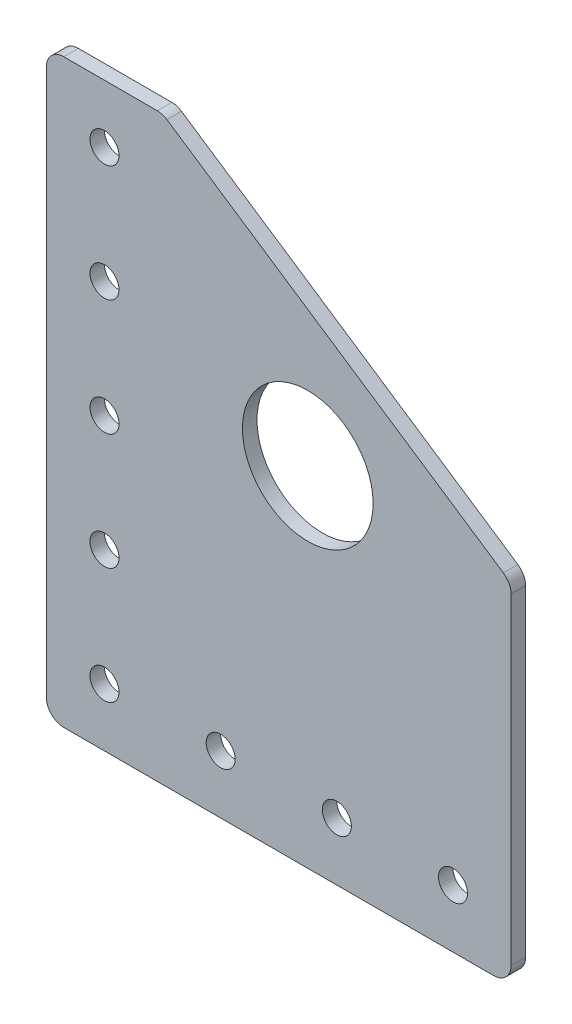
ISO-10303-21;
HEADER;
FILE_DESCRIPTION(('STEP AP214'),'2;1');
FILE_NAME('part.step','',(''),(''),'','','');
FILE_SCHEMA(('AUTOMOTIVE_DESIGN { 1 0 10303 214 1 1 1 1 }'));
ENDSEC;
DATA;
#1=APPLICATION_CONTEXT('core data for automotive mechanical design processes');
#2=APPLICATION_PROTOCOL_DEFINITION('international standard','automotive_design',2000,#1);
#3=PRODUCT_CONTEXT('',#1,'mechanical');
#4=PRODUCT('Part','Part','',(#3));
#5=PRODUCT_RELATED_PRODUCT_CATEGORY('part','',(#4));
#6=PRODUCT_DEFINITION_FORMATION('','',#4);
#7=PRODUCT_DEFINITION_CONTEXT('part definition',#1,'design');
#8=PRODUCT_DEFINITION('design','',#6,#7);
#9=PRODUCT_DEFINITION_SHAPE('','',#8);
#10=(LENGTH_UNIT() NAMED_UNIT(*) SI_UNIT(.MILLI.,.METRE.));
#11=(NAMED_UNIT(*) PLANE_ANGLE_UNIT() SI_UNIT($,.RADIAN.));
#12=(NAMED_UNIT(*) SI_UNIT($,.STERADIAN.) SOLID_ANGLE_UNIT());
#13=UNCERTAINTY_MEASURE_WITH_UNIT(LENGTH_MEASURE(1.E-05),#10,'distance_accuracy_value','');
#14=(GEOMETRIC_REPRESENTATION_CONTEXT(3) GLOBAL_UNCERTAINTY_ASSIGNED_CONTEXT((#13)) GLOBAL_UNIT_ASSIGNED_CONTEXT((#10,
#11,#12)) REPRESENTATION_CONTEXT('',''));
#15=CARTESIAN_POINT('',(0.,0.,0.));
#16=DIRECTION('',(0.,0.,1.));
#17=DIRECTION('',(1.,0.,0.));
#18=AXIS2_PLACEMENT_3D('',#15,#16,#17);
#19=CARTESIAN_POINT('',(0.,0.,3.175));
#20=DIRECTION('',(0.,0.,-1.));
#21=DIRECTION('',(-1.,0.,0.));
#22=AXIS2_PLACEMENT_3D('',#19,#20,#21);
#23=PLANE('',#22);
#24=DIRECTION('',(0.,-1.,0.));
#25=VECTOR('',#24,1.);
#26=CARTESIAN_POINT('',(0.,0.,3.175));
#27=LINE('',#26,#25);
#28=CARTESIAN_POINT('',(0.,123.19,3.175));
#29=VERTEX_POINT('',#28);
#30=CARTESIAN_POINT('',(0.,3.81,3.175));
#31=VERTEX_POINT('',#30);
#32=EDGE_CURVE('E160',#29,#31,#27,.T.);
#33=ORIENTED_EDGE('',*,*,#32,.T.);
#34=CARTESIAN_POINT('',(3.80999999999999,3.81,3.175));
#35=DIRECTION('',(0.,0.,-1.));
#36=DIRECTION('',(-1.,0.,0.));
#37=AXIS2_PLACEMENT_3D('',#34,#35,#36);
#38=CIRCLE('',#37,3.81);
#39=CARTESIAN_POINT('',(3.80999999999999,0.,3.175));
#40=VERTEX_POINT('',#39);
#41=EDGE_CURVE('E200',#31,#40,#38,.F.);
#42=ORIENTED_EDGE('',*,*,#41,.T.);
#43=DIRECTION('',(1.,0.,0.));
#44=VECTOR('',#43,1.);
#45=CARTESIAN_POINT('',(101.6,0.,3.175));
#46=LINE('',#45,#44);
#47=CARTESIAN_POINT('',(97.79,0.,3.175));
#48=VERTEX_POINT('',#47);
#49=EDGE_CURVE('E139',#40,#48,#46,.T.);
#50=ORIENTED_EDGE('',*,*,#49,.T.);
#51=CARTESIAN_POINT('',(97.79,3.80999999999999,3.175));
#52=DIRECTION('',(0.,0.,-1.));
#53=DIRECTION('',(-1.,0.,0.));
#54=AXIS2_PLACEMENT_3D('',#51,#52,#53);
#55=CIRCLE('',#54,3.81);
#56=CARTESIAN_POINT('',(101.6,3.81000000000002,3.175));
#57=VERTEX_POINT('',#56);
#58=EDGE_CURVE('E197',#48,#57,#55,.F.);
#59=ORIENTED_EDGE('',*,*,#58,.T.);
#60=DIRECTION('',(0.,1.,0.));
#61=VECTOR('',#60,1.);
#62=CARTESIAN_POINT('',(101.6,76.2,3.175));
#63=LINE('',#62,#61);
#64=CARTESIAN_POINT('',(101.6,74.1609498801607,3.175));
#65=VERTEX_POINT('',#64);
#66=EDGE_CURVE('E224',#57,#65,#63,.T.);
#67=ORIENTED_EDGE('',*,*,#66,.T.);
#68=CARTESIAN_POINT('',(97.79,74.1609498801607,3.175));
#69=DIRECTION('',(0.,0.,-1.));
#70=DIRECTION('',(-1.,0.,0.));
#71=AXIS2_PLACEMENT_3D('',#68,#69,#70);
#72=CIRCLE('',#71,3.81);
#73=CARTESIAN_POINT('',(99.9034077476181,77.3310615015879,3.175));
#74=VERTEX_POINT('',#73);
#75=EDGE_CURVE('E194',#65,#74,#72,.F.);
#76=ORIENTED_EDGE('',*,*,#75,.T.);
#77=DIRECTION('',(-0.832050294337844,0.554700196225229,0.));
#78=VECTOR('',#77,1.);
#79=CARTESIAN_POINT('',(25.4,127.,3.175));
#80=LINE('',#79,#78);
#81=CARTESIAN_POINT('',(26.3598325678592,126.360111621427,3.175));
#82=VERTEX_POINT('',#81);
#83=EDGE_CURVE('E222',#74,#82,#80,.T.);
#84=ORIENTED_EDGE('',*,*,#83,.T.);
#85=CARTESIAN_POINT('',(24.2464248202411,123.19,3.175));
#86=DIRECTION('',(0.,0.,-1.));
#87=DIRECTION('',(-1.,0.,0.));
#88=AXIS2_PLACEMENT_3D('',#85,#86,#87);
#89=CIRCLE('',#88,3.81);
#90=CARTESIAN_POINT('',(24.2464248202411,127.,3.175));
#91=VERTEX_POINT('',#90);
#92=EDGE_CURVE('E61',#82,#91,#89,.F.);
#93=ORIENTED_EDGE('',*,*,#92,.T.);
#94=DIRECTION('',(-1.,0.,0.));
#95=VECTOR('',#94,1.);
#96=CARTESIAN_POINT('',(0.,127.,3.175));
#97=LINE('',#96,#95);
#98=CARTESIAN_POINT('',(3.81,127.,3.175));
#99=VERTEX_POINT('',#98);
#100=EDGE_CURVE('E220',#91,#99,#97,.T.);
#101=ORIENTED_EDGE('',*,*,#100,.T.);
#102=CARTESIAN_POINT('',(3.81,123.19,3.175));
#103=DIRECTION('',(0.,0.,-1.));
#104=DIRECTION('',(-1.,0.,0.));
#105=AXIS2_PLACEMENT_3D('',#102,#103,#104);
#106=CIRCLE('',#105,3.81);
#107=EDGE_CURVE('E189',#99,#29,#106,.F.);
#108=ORIENTED_EDGE('',*,*,#107,.T.);
#109=EDGE_LOOP('',(#33,#42,#50,#59,#67,#76,#84,#93,#101,#108));
#110=FACE_BOUND('',#109,.T.);
#111=CARTESIAN_POINT('',(57.15,76.2,3.175));
#112=DIRECTION('',(0.,0.,1.));
#113=DIRECTION('',(1.,0.,0.));
#114=AXIS2_PLACEMENT_3D('',#111,#112,#113);
#115=CIRCLE('',#114,14.2875);
#116=CARTESIAN_POINT('',(71.4375,76.2,3.175));
#117=VERTEX_POINT('',#116);
#118=EDGE_CURVE('E149',#117,#117,#115,.T.);
#119=ORIENTED_EDGE('',*,*,#118,.F.);
#120=EDGE_LOOP('',(#119));
#121=FACE_BOUND('',#120,.T.);
#122=CARTESIAN_POINT('',(12.6999999999978,12.6999999999976,3.175));
#123=DIRECTION('',(0.,0.,1.));
#124=DIRECTION('',(1.,0.,0.));
#125=AXIS2_PLACEMENT_3D('',#122,#123,#124);
#126=CIRCLE('',#125,3.175);
#127=CARTESIAN_POINT('',(15.8749999999978,12.6999999999976,3.175));
#128=VERTEX_POINT('',#127);
#129=EDGE_CURVE('E234',#128,#128,#126,.T.);
#130=ORIENTED_EDGE('',*,*,#129,.F.);
#131=EDGE_LOOP('',(#130));
#132=FACE_BOUND('',#131,.T.);
#133=CARTESIAN_POINT('',(38.0999999999978,12.6999999999976,3.175));
#134=DIRECTION('',(0.,0.,1.));
#135=DIRECTION('',(1.,0.,0.));
#136=AXIS2_PLACEMENT_3D('',#133,#134,#135);
#137=CIRCLE('',#136,3.175);
#138=CARTESIAN_POINT('',(41.2749999999978,12.6999999999976,3.175));
#139=VERTEX_POINT('',#138);
#140=EDGE_CURVE('E240',#139,#139,#137,.T.);
#141=ORIENTED_EDGE('',*,*,#140,.F.);
#142=EDGE_LOOP('',(#141));
#143=FACE_BOUND('',#142,.T.);
#144=CARTESIAN_POINT('',(63.4999999999978,12.6999999999976,3.175));
#145=DIRECTION('',(0.,0.,1.));
#146=DIRECTION('',(1.,0.,0.));
#147=AXIS2_PLACEMENT_3D('',#144,#145,#146);
#148=CIRCLE('',#147,3.175);
#149=CARTESIAN_POINT('',(66.6749999999978,12.6999999999976,3.175));
#150=VERTEX_POINT('',#149);
#151=EDGE_CURVE('E248',#150,#150,#148,.T.);
#152=ORIENTED_EDGE('',*,*,#151,.F.);
#153=EDGE_LOOP('',(#152));
#154=FACE_BOUND('',#153,.T.);
#155=CARTESIAN_POINT('',(88.8999999999978,12.6999999999976,3.175));
#156=DIRECTION('',(0.,0.,1.));
#157=DIRECTION('',(1.,0.,0.));
#158=AXIS2_PLACEMENT_3D('',#155,#156,#157);
#159=CIRCLE('',#158,3.17500000000001);
#160=CARTESIAN_POINT('',(92.0749999999978,12.6999999999976,3.175));
#161=VERTEX_POINT('',#160);
#162=EDGE_CURVE('E256',#161,#161,#159,.T.);
#163=ORIENTED_EDGE('',*,*,#162,.F.);
#164=EDGE_LOOP('',(#163));
#165=FACE_BOUND('',#164,.T.);
#166=CARTESIAN_POINT('',(12.6999999999977,38.0999999999976,3.175));
#167=DIRECTION('',(0.,0.,1.));
#168=DIRECTION('',(1.,0.,0.));
#169=AXIS2_PLACEMENT_3D('',#166,#167,#168);
#170=CIRCLE('',#169,3.175);
#171=CARTESIAN_POINT('',(15.8749999999977,38.0999999999976,3.175));
#172=VERTEX_POINT('',#171);
#173=EDGE_CURVE('E264',#172,#172,#170,.T.);
#174=ORIENTED_EDGE('',*,*,#173,.F.);
#175=EDGE_LOOP('',(#174));
#176=FACE_BOUND('',#175,.T.);
#177=CARTESIAN_POINT('',(12.6999999999977,63.4999999999976,3.175));
#178=DIRECTION('',(0.,0.,1.));
#179=DIRECTION('',(1.,0.,0.));
#180=AXIS2_PLACEMENT_3D('',#177,#178,#179);
#181=CIRCLE('',#180,3.175);
#182=CARTESIAN_POINT('',(15.8749999999977,63.4999999999976,3.175));
#183=VERTEX_POINT('',#182);
#184=EDGE_CURVE('E272',#183,#183,#181,.T.);
#185=ORIENTED_EDGE('',*,*,#184,.F.);
#186=EDGE_LOOP('',(#185));
#187=FACE_BOUND('',#186,.T.);
#188=CARTESIAN_POINT('',(12.6999999999976,88.8999999999976,3.175));
#189=DIRECTION('',(0.,0.,1.));
#190=DIRECTION('',(1.,0.,0.));
#191=AXIS2_PLACEMENT_3D('',#188,#189,#190);
#192=CIRCLE('',#191,3.175);
#193=CARTESIAN_POINT('',(15.8749999999976,88.8999999999976,3.175));
#194=VERTEX_POINT('',#193);
#195=EDGE_CURVE('E280',#194,#194,#192,.T.);
#196=ORIENTED_EDGE('',*,*,#195,.F.);
#197=EDGE_LOOP('',(#196));
#198=FACE_BOUND('',#197,.T.);
#199=CARTESIAN_POINT('',(12.6999999999975,114.299999999998,3.175));
#200=DIRECTION('',(0.,0.,1.));
#201=DIRECTION('',(1.,0.,0.));
#202=AXIS2_PLACEMENT_3D('',#199,#200,#201);
#203=CIRCLE('',#202,3.175);
#204=CARTESIAN_POINT('',(15.8749999999975,114.299999999998,3.175));
#205=VERTEX_POINT('',#204);
#206=EDGE_CURVE('E288',#205,#205,#203,.T.);
#207=ORIENTED_EDGE('',*,*,#206,.F.);
#208=EDGE_LOOP('',(#207));
#209=FACE_BOUND('',#208,.T.);
#210=ADVANCED_FACE('F39',(#110,#121,#132,#143,#154,#165,#176,#187,#198,#209),#23,.F.);
#211=CARTESIAN_POINT('',(0.,0.,0.));
#212=DIRECTION('',(0.,0.,-1.));
#213=DIRECTION('',(-1.,0.,0.));
#214=AXIS2_PLACEMENT_3D('',#211,#212,#213);
#215=PLANE('',#214);
#216=CARTESIAN_POINT('',(12.6999999999976,88.8999999999976,0.));
#217=DIRECTION('',(0.,0.,1.));
#218=DIRECTION('',(1.,0.,0.));
#219=AXIS2_PLACEMENT_3D('',#216,#217,#218);
#220=CIRCLE('',#219,3.175);
#221=CARTESIAN_POINT('',(15.8749999999976,88.8999999999976,0.));
#222=VERTEX_POINT('',#221);
#223=EDGE_CURVE('E284',#222,#222,#220,.T.);
#224=ORIENTED_EDGE('',*,*,#223,.T.);
#225=EDGE_LOOP('',(#224));
#226=FACE_BOUND('',#225,.T.);
#227=CARTESIAN_POINT('',(12.6999999999977,38.0999999999976,0.));
#228=DIRECTION('',(0.,0.,1.));
#229=DIRECTION('',(1.,0.,0.));
#230=AXIS2_PLACEMENT_3D('',#227,#228,#229);
#231=CIRCLE('',#230,3.175);
#232=CARTESIAN_POINT('',(15.8749999999977,38.0999999999976,0.));
#233=VERTEX_POINT('',#232);
#234=EDGE_CURVE('E268',#233,#233,#231,.T.);
#235=ORIENTED_EDGE('',*,*,#234,.T.);
#236=EDGE_LOOP('',(#235));
#237=FACE_BOUND('',#236,.T.);
#238=CARTESIAN_POINT('',(63.4999999999978,12.6999999999976,0.));
#239=DIRECTION('',(0.,0.,1.));
#240=DIRECTION('',(1.,0.,0.));
#241=AXIS2_PLACEMENT_3D('',#238,#239,#240);
#242=CIRCLE('',#241,3.175);
#243=CARTESIAN_POINT('',(66.6749999999978,12.6999999999976,0.));
#244=VERTEX_POINT('',#243);
#245=EDGE_CURVE('E252',#244,#244,#242,.T.);
#246=ORIENTED_EDGE('',*,*,#245,.T.);
#247=EDGE_LOOP('',(#246));
#248=FACE_BOUND('',#247,.T.);
#249=CARTESIAN_POINT('',(12.6999999999978,12.6999999999976,0.));
#250=DIRECTION('',(0.,0.,1.));
#251=DIRECTION('',(1.,0.,0.));
#252=AXIS2_PLACEMENT_3D('',#249,#250,#251);
#253=CIRCLE('',#252,3.175);
#254=CARTESIAN_POINT('',(15.8749999999978,12.6999999999976,0.));
#255=VERTEX_POINT('',#254);
#256=EDGE_CURVE('E236',#255,#255,#253,.T.);
#257=ORIENTED_EDGE('',*,*,#256,.T.);
#258=EDGE_LOOP('',(#257));
#259=FACE_BOUND('',#258,.T.);
#260=DIRECTION('',(1.,0.,0.));
#261=VECTOR('',#260,1.);
#262=CARTESIAN_POINT('',(101.6,0.,0.));
#263=LINE('',#262,#261);
#264=CARTESIAN_POINT('',(3.80999999999999,0.,0.));
#265=VERTEX_POINT('',#264);
#266=CARTESIAN_POINT('',(97.79,0.,0.));
#267=VERTEX_POINT('',#266);
#268=EDGE_CURVE('E136',#265,#267,#263,.T.);
#269=ORIENTED_EDGE('',*,*,#268,.F.);
#270=CARTESIAN_POINT('',(3.80999999999999,3.81,0.));
#271=DIRECTION('',(0.,0.,-1.));
#272=DIRECTION('',(-1.,0.,0.));
#273=AXIS2_PLACEMENT_3D('',#270,#271,#272);
#274=CIRCLE('',#273,3.81);
#275=CARTESIAN_POINT('',(0.,3.81,0.));
#276=VERTEX_POINT('',#275);
#277=EDGE_CURVE('E118',#265,#276,#274,.T.);
#278=ORIENTED_EDGE('',*,*,#277,.T.);
#279=DIRECTION('',(0.,-1.,0.));
#280=VECTOR('',#279,1.);
#281=CARTESIAN_POINT('',(0.,0.,0.));
#282=LINE('',#281,#280);
#283=CARTESIAN_POINT('',(0.,123.19,0.));
#284=VERTEX_POINT('',#283);
#285=EDGE_CURVE('E169',#284,#276,#282,.T.);
#286=ORIENTED_EDGE('',*,*,#285,.F.);
#287=CARTESIAN_POINT('',(3.81,123.19,0.));
#288=DIRECTION('',(0.,0.,-1.));
#289=DIRECTION('',(-1.,0.,0.));
#290=AXIS2_PLACEMENT_3D('',#287,#288,#289);
#291=CIRCLE('',#290,3.81);
#292=CARTESIAN_POINT('',(3.81,127.,0.));
#293=VERTEX_POINT('',#292);
#294=EDGE_CURVE('E141',#284,#293,#291,.T.);
#295=ORIENTED_EDGE('',*,*,#294,.T.);
#296=DIRECTION('',(-1.,0.,0.));
#297=VECTOR('',#296,1.);
#298=CARTESIAN_POINT('',(0.,127.,0.));
#299=LINE('',#298,#297);
#300=CARTESIAN_POINT('',(24.2464248202411,127.,0.));
#301=VERTEX_POINT('',#300);
#302=EDGE_CURVE('E166',#301,#293,#299,.T.);
#303=ORIENTED_EDGE('',*,*,#302,.F.);
#304=CARTESIAN_POINT('',(24.2464248202411,123.19,0.));
#305=DIRECTION('',(0.,0.,-1.));
#306=DIRECTION('',(-1.,0.,0.));
#307=AXIS2_PLACEMENT_3D('',#304,#305,#306);
#308=CIRCLE('',#307,3.81);
#309=CARTESIAN_POINT('',(26.3598325678592,126.360111621427,0.));
#310=VERTEX_POINT('',#309);
#311=EDGE_CURVE('E176',#301,#310,#308,.T.);
#312=ORIENTED_EDGE('',*,*,#311,.T.);
#313=DIRECTION('',(-0.832050294337844,0.554700196225229,0.));
#314=VECTOR('',#313,1.);
#315=CARTESIAN_POINT('',(25.4,127.,0.));
#316=LINE('',#315,#314);
#317=CARTESIAN_POINT('',(99.9034077476181,77.3310615015879,0.));
#318=VERTEX_POINT('',#317);
#319=EDGE_CURVE('E154',#318,#310,#316,.T.);
#320=ORIENTED_EDGE('',*,*,#319,.F.);
#321=CARTESIAN_POINT('',(97.79,74.1609498801607,0.));
#322=DIRECTION('',(0.,0.,-1.));
#323=DIRECTION('',(-1.,0.,0.));
#324=AXIS2_PLACEMENT_3D('',#321,#322,#323);
#325=CIRCLE('',#324,3.81);
#326=CARTESIAN_POINT('',(101.6,74.1609498801607,0.));
#327=VERTEX_POINT('',#326);
#328=EDGE_CURVE('E179',#318,#327,#325,.T.);
#329=ORIENTED_EDGE('',*,*,#328,.T.);
#330=DIRECTION('',(0.,1.,0.));
#331=VECTOR('',#330,1.);
#332=CARTESIAN_POINT('',(101.6,76.2,0.));
#333=LINE('',#332,#331);
#334=CARTESIAN_POINT('',(101.6,3.81000000000002,0.));
#335=VERTEX_POINT('',#334);
#336=EDGE_CURVE('E148',#335,#327,#333,.T.);
#337=ORIENTED_EDGE('',*,*,#336,.F.);
#338=CARTESIAN_POINT('',(97.79,3.80999999999999,0.));
#339=DIRECTION('',(0.,0.,-1.));
#340=DIRECTION('',(-1.,0.,0.));
#341=AXIS2_PLACEMENT_3D('',#338,#339,#340);
#342=CIRCLE('',#341,3.81);
#343=EDGE_CURVE('E130',#335,#267,#342,.T.);
#344=ORIENTED_EDGE('',*,*,#343,.T.);
#345=EDGE_LOOP('',(#269,#278,#286,#295,#303,#312,#320,#329,#337,#344));
#346=FACE_BOUND('',#345,.T.);
#347=CARTESIAN_POINT('',(57.15,76.2,0.));
#348=DIRECTION('',(0.,0.,1.));
#349=DIRECTION('',(1.,0.,0.));
#350=AXIS2_PLACEMENT_3D('',#347,#348,#349);
#351=CIRCLE('',#350,14.2875);
#352=CARTESIAN_POINT('',(71.4375,76.2,0.));
#353=VERTEX_POINT('',#352);
#354=EDGE_CURVE('E157',#353,#353,#351,.T.);
#355=ORIENTED_EDGE('',*,*,#354,.T.);
#356=EDGE_LOOP('',(#355));
#357=FACE_BOUND('',#356,.T.);
#358=CARTESIAN_POINT('',(38.0999999999978,12.6999999999976,0.));
#359=DIRECTION('',(0.,0.,1.));
#360=DIRECTION('',(1.,0.,0.));
#361=AXIS2_PLACEMENT_3D('',#358,#359,#360);
#362=CIRCLE('',#361,3.175);
#363=CARTESIAN_POINT('',(41.2749999999978,12.6999999999976,0.));
#364=VERTEX_POINT('',#363);
#365=EDGE_CURVE('E244',#364,#364,#362,.T.);
#366=ORIENTED_EDGE('',*,*,#365,.T.);
#367=EDGE_LOOP('',(#366));
#368=FACE_BOUND('',#367,.T.);
#369=CARTESIAN_POINT('',(88.8999999999978,12.6999999999976,0.));
#370=DIRECTION('',(0.,0.,1.));
#371=DIRECTION('',(1.,0.,0.));
#372=AXIS2_PLACEMENT_3D('',#369,#370,#371);
#373=CIRCLE('',#372,3.17500000000001);
#374=CARTESIAN_POINT('',(92.0749999999978,12.6999999999976,0.));
#375=VERTEX_POINT('',#374);
#376=EDGE_CURVE('E260',#375,#375,#373,.T.);
#377=ORIENTED_EDGE('',*,*,#376,.T.);
#378=EDGE_LOOP('',(#377));
#379=FACE_BOUND('',#378,.T.);
#380=CARTESIAN_POINT('',(12.6999999999977,63.4999999999976,0.));
#381=DIRECTION('',(0.,0.,1.));
#382=DIRECTION('',(1.,0.,0.));
#383=AXIS2_PLACEMENT_3D('',#380,#381,#382);
#384=CIRCLE('',#383,3.175);
#385=CARTESIAN_POINT('',(15.8749999999977,63.4999999999976,0.));
#386=VERTEX_POINT('',#385);
#387=EDGE_CURVE('E276',#386,#386,#384,.T.);
#388=ORIENTED_EDGE('',*,*,#387,.T.);
#389=EDGE_LOOP('',(#388));
#390=FACE_BOUND('',#389,.T.);
#391=CARTESIAN_POINT('',(12.6999999999975,114.299999999998,0.));
#392=DIRECTION('',(0.,0.,1.));
#393=DIRECTION('',(1.,0.,0.));
#394=AXIS2_PLACEMENT_3D('',#391,#392,#393);
#395=CIRCLE('',#394,3.175);
#396=CARTESIAN_POINT('',(15.8749999999975,114.299999999998,0.));
#397=VERTEX_POINT('',#396);
#398=EDGE_CURVE('E292',#397,#397,#395,.T.);
#399=ORIENTED_EDGE('',*,*,#398,.T.);
#400=EDGE_LOOP('',(#399));
#401=FACE_BOUND('',#400,.T.);
#402=ADVANCED_FACE('F144',(#226,#237,#248,#259,#346,#357,#368,#379,#390,#401),#215,.T.);
#403=CARTESIAN_POINT('',(101.6,0.,3.175));
#404=DIRECTION('',(0.,1.,0.));
#405=DIRECTION('',(-1.,0.,0.));
#406=AXIS2_PLACEMENT_3D('',#403,#404,#405);
#407=PLANE('',#406);
#408=ORIENTED_EDGE('',*,*,#49,.F.);
#409=DIRECTION('',(0.,0.,-1.));
#410=VECTOR('',#409,1.);
#411=CARTESIAN_POINT('',(3.80999999999999,0.,3.175));
#412=LINE('',#411,#410);
#413=EDGE_CURVE('E122',#40,#265,#412,.T.);
#414=ORIENTED_EDGE('',*,*,#413,.T.);
#415=ORIENTED_EDGE('',*,*,#268,.T.);
#416=DIRECTION('',(0.,0.,-1.));
#417=VECTOR('',#416,1.);
#418=CARTESIAN_POINT('',(97.79,0.,3.175));
#419=LINE('',#418,#417);
#420=EDGE_CURVE('E142',#267,#48,#419,.F.);
#421=ORIENTED_EDGE('',*,*,#420,.T.);
#422=EDGE_LOOP('',(#408,#414,#415,#421));
#423=FACE_BOUND('',#422,.T.);
#424=ADVANCED_FACE('F135',(#423),#407,.F.);
#425=CARTESIAN_POINT('',(101.6,76.2,3.175));
#426=DIRECTION('',(-1.,0.,0.));
#427=DIRECTION('',(0.,-1.,0.));
#428=AXIS2_PLACEMENT_3D('',#425,#426,#427);
#429=PLANE('',#428);
#430=ORIENTED_EDGE('',*,*,#66,.F.);
#431=DIRECTION('',(0.,0.,-1.));
#432=VECTOR('',#431,1.);
#433=CARTESIAN_POINT('',(101.6,3.80999999999999,3.175));
#434=LINE('',#433,#432);
#435=EDGE_CURVE('E206',#57,#335,#434,.T.);
#436=ORIENTED_EDGE('',*,*,#435,.T.);
#437=ORIENTED_EDGE('',*,*,#336,.T.);
#438=DIRECTION('',(0.,0.,-1.));
#439=VECTOR('',#438,1.);
#440=CARTESIAN_POINT('',(101.6,74.1609498801607,3.175));
#441=LINE('',#440,#439);
#442=EDGE_CURVE('E203',#327,#65,#441,.F.);
#443=ORIENTED_EDGE('',*,*,#442,.T.);
#444=EDGE_LOOP('',(#430,#436,#437,#443));
#445=FACE_BOUND('',#444,.T.);
#446=ADVANCED_FACE('F325',(#445),#429,.F.);
#447=CARTESIAN_POINT('',(25.4,127.,3.175));
#448=DIRECTION('',(-0.554700196225229,-0.832050294337844,0.));
#449=DIRECTION('',(0.832050294337844,-0.554700196225229,0.));
#450=AXIS2_PLACEMENT_3D('',#447,#448,#449);
#451=PLANE('',#450);
#452=ORIENTED_EDGE('',*,*,#83,.F.);
#453=DIRECTION('',(0.,0.,-1.));
#454=VECTOR('',#453,1.);
#455=CARTESIAN_POINT('',(99.9034077476181,77.3310615015879,3.175));
#456=LINE('',#455,#454);
#457=EDGE_CURVE('E213',#74,#318,#456,.T.);
#458=ORIENTED_EDGE('',*,*,#457,.T.);
#459=ORIENTED_EDGE('',*,*,#319,.T.);
#460=DIRECTION('',(0.,0.,-1.));
#461=VECTOR('',#460,1.);
#462=CARTESIAN_POINT('',(26.3598325678592,126.360111621427,3.175));
#463=LINE('',#462,#461);
#464=EDGE_CURVE('E210',#310,#82,#463,.F.);
#465=ORIENTED_EDGE('',*,*,#464,.T.);
#466=EDGE_LOOP('',(#452,#458,#459,#465));
#467=FACE_BOUND('',#466,.T.);
#468=ADVANCED_FACE('F322',(#467),#451,.F.);
#469=CARTESIAN_POINT('',(0.,127.,3.175));
#470=DIRECTION('',(0.,-1.,0.));
#471=DIRECTION('',(0.,0.,-1.));
#472=AXIS2_PLACEMENT_3D('',#469,#470,#471);
#473=PLANE('',#472);
#474=ORIENTED_EDGE('',*,*,#100,.F.);
#475=DIRECTION('',(0.,0.,-1.));
#476=VECTOR('',#475,1.);
#477=CARTESIAN_POINT('',(24.2464248202411,127.,3.175));
#478=LINE('',#477,#476);
#479=EDGE_CURVE('E11',#91,#301,#478,.T.);
#480=ORIENTED_EDGE('',*,*,#479,.T.);
#481=ORIENTED_EDGE('',*,*,#302,.T.);
#482=DIRECTION('',(0.,0.,-1.));
#483=VECTOR('',#482,1.);
#484=CARTESIAN_POINT('',(3.81,127.,3.175));
#485=LINE('',#484,#483);
#486=EDGE_CURVE('E48',#293,#99,#485,.F.);
#487=ORIENTED_EDGE('',*,*,#486,.T.);
#488=EDGE_LOOP('',(#474,#480,#481,#487));
#489=FACE_BOUND('',#488,.T.);
#490=ADVANCED_FACE('F318',(#489),#473,.F.);
#491=CARTESIAN_POINT('',(0.,0.,3.175));
#492=DIRECTION('',(1.,0.,0.));
#493=DIRECTION('',(0.,0.,-1.));
#494=AXIS2_PLACEMENT_3D('',#491,#492,#493);
#495=PLANE('',#494);
#496=ORIENTED_EDGE('',*,*,#285,.T.);
#497=DIRECTION('',(0.,0.,-1.));
#498=VECTOR('',#497,1.);
#499=CARTESIAN_POINT('',(0.,3.81,3.175));
#500=LINE('',#499,#498);
#501=EDGE_CURVE('E123',#276,#31,#500,.F.);
#502=ORIENTED_EDGE('',*,*,#501,.T.);
#503=ORIENTED_EDGE('',*,*,#32,.F.);
#504=DIRECTION('',(0.,0.,-1.));
#505=VECTOR('',#504,1.);
#506=CARTESIAN_POINT('',(0.,123.19,3.175));
#507=LINE('',#506,#505);
#508=EDGE_CURVE('E129',#29,#284,#507,.T.);
#509=ORIENTED_EDGE('',*,*,#508,.T.);
#510=EDGE_LOOP('',(#496,#502,#503,#509));
#511=FACE_BOUND('',#510,.T.);
#512=ADVANCED_FACE('F315',(#511),#495,.F.);
#513=CARTESIAN_POINT('',(57.15,76.2,3.175));
#514=DIRECTION('',(0.,0.,-1.));
#515=DIRECTION('',(-1.,0.,0.));
#516=AXIS2_PLACEMENT_3D('',#513,#514,#515);
#517=CYLINDRICAL_SURFACE('',#516,14.2875);
#518=ORIENTED_EDGE('',*,*,#118,.T.);
#519=EDGE_LOOP('',(#518));
#520=FACE_BOUND('',#519,.T.);
#521=ORIENTED_EDGE('',*,*,#354,.F.);
#522=EDGE_LOOP('',(#521));
#523=FACE_BOUND('',#522,.T.);
#524=ADVANCED_FACE('F312',(#520,#523),#517,.F.);
#525=CARTESIAN_POINT('',(12.6999999999978,12.6999999999976,3.175));
#526=DIRECTION('',(0.,0.,-1.));
#527=DIRECTION('',(-1.,0.,0.));
#528=AXIS2_PLACEMENT_3D('',#525,#526,#527);
#529=CYLINDRICAL_SURFACE('',#528,3.175);
#530=ORIENTED_EDGE('',*,*,#129,.T.);
#531=EDGE_LOOP('',(#530));
#532=FACE_BOUND('',#531,.T.);
#533=ORIENTED_EDGE('',*,*,#256,.F.);
#534=EDGE_LOOP('',(#533));
#535=FACE_BOUND('',#534,.T.);
#536=ADVANCED_FACE('F495',(#532,#535),#529,.F.);
#537=CARTESIAN_POINT('',(38.0999999999978,12.6999999999976,3.175));
#538=DIRECTION('',(0.,0.,-1.));
#539=DIRECTION('',(-1.,0.,0.));
#540=AXIS2_PLACEMENT_3D('',#537,#538,#539);
#541=CYLINDRICAL_SURFACE('',#540,3.175);
#542=ORIENTED_EDGE('',*,*,#140,.T.);
#543=EDGE_LOOP('',(#542));
#544=FACE_BOUND('',#543,.T.);
#545=ORIENTED_EDGE('',*,*,#365,.F.);
#546=EDGE_LOOP('',(#545));
#547=FACE_BOUND('',#546,.T.);
#548=ADVANCED_FACE('F485',(#544,#547),#541,.F.);
#549=CARTESIAN_POINT('',(63.4999999999978,12.6999999999976,3.175));
#550=DIRECTION('',(0.,0.,-1.));
#551=DIRECTION('',(-1.,0.,0.));
#552=AXIS2_PLACEMENT_3D('',#549,#550,#551);
#553=CYLINDRICAL_SURFACE('',#552,3.175);
#554=ORIENTED_EDGE('',*,*,#151,.T.);
#555=EDGE_LOOP('',(#554));
#556=FACE_BOUND('',#555,.T.);
#557=ORIENTED_EDGE('',*,*,#245,.F.);
#558=EDGE_LOOP('',(#557));
#559=FACE_BOUND('',#558,.T.);
#560=ADVANCED_FACE('F475',(#556,#559),#553,.F.);
#561=CARTESIAN_POINT('',(88.8999999999978,12.6999999999976,3.175));
#562=DIRECTION('',(0.,0.,-1.));
#563=DIRECTION('',(-1.,0.,0.));
#564=AXIS2_PLACEMENT_3D('',#561,#562,#563);
#565=CYLINDRICAL_SURFACE('',#564,3.17500000000001);
#566=ORIENTED_EDGE('',*,*,#162,.T.);
#567=EDGE_LOOP('',(#566));
#568=FACE_BOUND('',#567,.T.);
#569=ORIENTED_EDGE('',*,*,#376,.F.);
#570=EDGE_LOOP('',(#569));
#571=FACE_BOUND('',#570,.T.);
#572=ADVANCED_FACE('F465',(#568,#571),#565,.F.);
#573=CARTESIAN_POINT('',(12.6999999999977,38.0999999999976,3.175));
#574=DIRECTION('',(0.,0.,-1.));
#575=DIRECTION('',(-1.,0.,0.));
#576=AXIS2_PLACEMENT_3D('',#573,#574,#575);
#577=CYLINDRICAL_SURFACE('',#576,3.175);
#578=ORIENTED_EDGE('',*,*,#173,.T.);
#579=EDGE_LOOP('',(#578));
#580=FACE_BOUND('',#579,.T.);
#581=ORIENTED_EDGE('',*,*,#234,.F.);
#582=EDGE_LOOP('',(#581));
#583=FACE_BOUND('',#582,.T.);
#584=ADVANCED_FACE('F455',(#580,#583),#577,.F.);
#585=CARTESIAN_POINT('',(12.6999999999977,63.4999999999976,3.175));
#586=DIRECTION('',(0.,0.,-1.));
#587=DIRECTION('',(-1.,0.,0.));
#588=AXIS2_PLACEMENT_3D('',#585,#586,#587);
#589=CYLINDRICAL_SURFACE('',#588,3.175);
#590=ORIENTED_EDGE('',*,*,#184,.T.);
#591=EDGE_LOOP('',(#590));
#592=FACE_BOUND('',#591,.T.);
#593=ORIENTED_EDGE('',*,*,#387,.F.);
#594=EDGE_LOOP('',(#593));
#595=FACE_BOUND('',#594,.T.);
#596=ADVANCED_FACE('F445',(#592,#595),#589,.F.);
#597=CARTESIAN_POINT('',(12.6999999999976,88.8999999999976,3.175));
#598=DIRECTION('',(0.,0.,-1.));
#599=DIRECTION('',(-1.,0.,0.));
#600=AXIS2_PLACEMENT_3D('',#597,#598,#599);
#601=CYLINDRICAL_SURFACE('',#600,3.175);
#602=ORIENTED_EDGE('',*,*,#195,.T.);
#603=EDGE_LOOP('',(#602));
#604=FACE_BOUND('',#603,.T.);
#605=ORIENTED_EDGE('',*,*,#223,.F.);
#606=EDGE_LOOP('',(#605));
#607=FACE_BOUND('',#606,.T.);
#608=ADVANCED_FACE('F436',(#604,#607),#601,.F.);
#609=CARTESIAN_POINT('',(12.6999999999975,114.299999999998,3.175));
#610=DIRECTION('',(0.,0.,-1.));
#611=DIRECTION('',(-1.,0.,0.));
#612=AXIS2_PLACEMENT_3D('',#609,#610,#611);
#613=CYLINDRICAL_SURFACE('',#612,3.175);
#614=ORIENTED_EDGE('',*,*,#206,.T.);
#615=EDGE_LOOP('',(#614));
#616=FACE_BOUND('',#615,.T.);
#617=ORIENTED_EDGE('',*,*,#398,.F.);
#618=EDGE_LOOP('',(#617));
#619=FACE_BOUND('',#618,.T.);
#620=ADVANCED_FACE('F300',(#616,#619),#613,.F.);
#621=CARTESIAN_POINT('',(3.80999999999999,3.81,3.175));
#622=DIRECTION('',(0.,0.,-1.));
#623=DIRECTION('',(-1.,0.,0.));
#624=AXIS2_PLACEMENT_3D('',#621,#622,#623);
#625=CYLINDRICAL_SURFACE('',#624,3.81);
#626=ORIENTED_EDGE('',*,*,#41,.F.);
#627=ORIENTED_EDGE('',*,*,#501,.F.);
#628=ORIENTED_EDGE('',*,*,#277,.F.);
#629=ORIENTED_EDGE('',*,*,#413,.F.);
#630=EDGE_LOOP('',(#626,#627,#628,#629));
#631=FACE_BOUND('',#630,.T.);
#632=ADVANCED_FACE('F121',(#631),#625,.T.);
#633=CARTESIAN_POINT('',(97.79,3.80999999999999,3.175));
#634=DIRECTION('',(0.,0.,-1.));
#635=DIRECTION('',(-1.,0.,0.));
#636=AXIS2_PLACEMENT_3D('',#633,#634,#635);
#637=CYLINDRICAL_SURFACE('',#636,3.81);
#638=ORIENTED_EDGE('',*,*,#58,.F.);
#639=ORIENTED_EDGE('',*,*,#420,.F.);
#640=ORIENTED_EDGE('',*,*,#343,.F.);
#641=ORIENTED_EDGE('',*,*,#435,.F.);
#642=EDGE_LOOP('',(#638,#639,#640,#641));
#643=FACE_BOUND('',#642,.T.);
#644=ADVANCED_FACE('F334',(#643),#637,.T.);
#645=CARTESIAN_POINT('',(97.79,74.1609498801607,3.175));
#646=DIRECTION('',(0.,0.,-1.));
#647=DIRECTION('',(-1.,0.,0.));
#648=AXIS2_PLACEMENT_3D('',#645,#646,#647);
#649=CYLINDRICAL_SURFACE('',#648,3.81);
#650=ORIENTED_EDGE('',*,*,#75,.F.);
#651=ORIENTED_EDGE('',*,*,#442,.F.);
#652=ORIENTED_EDGE('',*,*,#328,.F.);
#653=ORIENTED_EDGE('',*,*,#457,.F.);
#654=EDGE_LOOP('',(#650,#651,#652,#653));
#655=FACE_BOUND('',#654,.T.);
#656=ADVANCED_FACE('F337',(#655),#649,.T.);
#657=CARTESIAN_POINT('',(24.2464248202411,123.19,3.175));
#658=DIRECTION('',(0.,0.,-1.));
#659=DIRECTION('',(-1.,0.,0.));
#660=AXIS2_PLACEMENT_3D('',#657,#658,#659);
#661=CYLINDRICAL_SURFACE('',#660,3.81);
#662=ORIENTED_EDGE('',*,*,#92,.F.);
#663=ORIENTED_EDGE('',*,*,#464,.F.);
#664=ORIENTED_EDGE('',*,*,#311,.F.);
#665=ORIENTED_EDGE('',*,*,#479,.F.);
#666=EDGE_LOOP('',(#662,#663,#664,#665));
#667=FACE_BOUND('',#666,.T.);
#668=ADVANCED_FACE('F340',(#667),#661,.T.);
#669=CARTESIAN_POINT('',(3.81,123.19,3.175));
#670=DIRECTION('',(0.,0.,-1.));
#671=DIRECTION('',(-1.,0.,0.));
#672=AXIS2_PLACEMENT_3D('',#669,#670,#671);
#673=CYLINDRICAL_SURFACE('',#672,3.81);
#674=ORIENTED_EDGE('',*,*,#107,.F.);
#675=ORIENTED_EDGE('',*,*,#486,.F.);
#676=ORIENTED_EDGE('',*,*,#294,.F.);
#677=ORIENTED_EDGE('',*,*,#508,.F.);
#678=EDGE_LOOP('',(#674,#675,#676,#677));
#679=FACE_BOUND('',#678,.T.);
#680=ADVANCED_FACE('F41',(#679),#673,.T.);
#681=CLOSED_SHELL('',(#210,#402,#424,#446,#468,#490,#512,#524,#536,#548,#560,#572,#584,#596,
#608,#620,#632,#644,#656,#668,#680));
#682=MANIFOLD_SOLID_BREP('B2',#681);
#683=ADVANCED_BREP_SHAPE_REPRESENTATION('',(#18,#682),#14);
#684=SHAPE_DEFINITION_REPRESENTATION(#9,#683);
ENDSEC;
END-ISO-10303-21;
